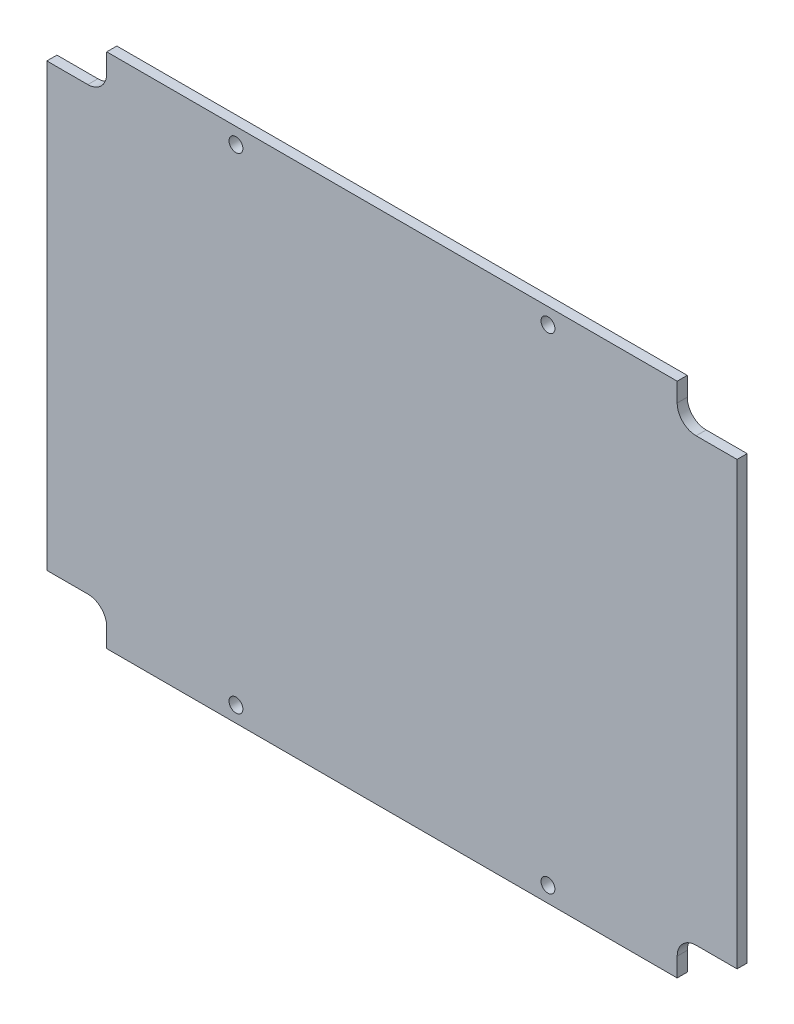
ISO-10303-21;
HEADER;
FILE_DESCRIPTION(('STEP AP214'),'2;1');
FILE_NAME('part.step','',(''),(''),'','','');
FILE_SCHEMA(('AUTOMOTIVE_DESIGN { 1 0 10303 214 1 1 1 1 }'));
ENDSEC;
DATA;
#1=APPLICATION_CONTEXT('core data for automotive mechanical design processes');
#2=APPLICATION_PROTOCOL_DEFINITION('international standard','automotive_design',2000,#1);
#3=PRODUCT_CONTEXT('',#1,'mechanical');
#4=PRODUCT('Part','Part','',(#3));
#5=PRODUCT_RELATED_PRODUCT_CATEGORY('part','',(#4));
#6=PRODUCT_DEFINITION_FORMATION('','',#4);
#7=PRODUCT_DEFINITION_CONTEXT('part definition',#1,'design');
#8=PRODUCT_DEFINITION('design','',#6,#7);
#9=PRODUCT_DEFINITION_SHAPE('','',#8);
#10=(LENGTH_UNIT() NAMED_UNIT(*) SI_UNIT(.MILLI.,.METRE.));
#11=(NAMED_UNIT(*) PLANE_ANGLE_UNIT() SI_UNIT($,.RADIAN.));
#12=(NAMED_UNIT(*) SI_UNIT($,.STERADIAN.) SOLID_ANGLE_UNIT());
#13=UNCERTAINTY_MEASURE_WITH_UNIT(LENGTH_MEASURE(1.E-05),#10,'distance_accuracy_value','');
#14=(GEOMETRIC_REPRESENTATION_CONTEXT(3) GLOBAL_UNCERTAINTY_ASSIGNED_CONTEXT((#13)) GLOBAL_UNIT_ASSIGNED_CONTEXT((#10,
#11,#12)) REPRESENTATION_CONTEXT('',''));
#15=CARTESIAN_POINT('',(0.,0.,0.));
#16=DIRECTION('',(0.,0.,1.));
#17=DIRECTION('',(1.,0.,0.));
#18=AXIS2_PLACEMENT_3D('',#15,#16,#17);
#19=CARTESIAN_POINT('',(-55.493641501856,9.95185693007489,1.6));
#20=DIRECTION('',(0.,0.,1.));
#21=DIRECTION('',(1.,0.,0.));
#22=AXIS2_PLACEMENT_3D('',#19,#20,#21);
#23=PLANE('',#22);
#24=CARTESIAN_POINT('',(24.006358498144,6.45185693007488,1.6));
#25=DIRECTION('',(0.,0.,1.));
#26=DIRECTION('',(1.,0.,0.));
#27=AXIS2_PLACEMENT_3D('',#24,#25,#26);
#28=CIRCLE('',#27,1.1);
#29=CARTESIAN_POINT('',(25.106358498144,6.45185693007488,1.6));
#30=VERTEX_POINT('',#29);
#31=EDGE_CURVE('E321',#30,#30,#28,.T.);
#32=ORIENTED_EDGE('',*,*,#31,.F.);
#33=EDGE_LOOP('',(#32));
#34=FACE_BOUND('',#33,.T.);
#35=CARTESIAN_POINT('',(-25.493641501856,83.4518569300749,1.6));
#36=DIRECTION('',(0.,0.,1.));
#37=DIRECTION('',(1.,0.,0.));
#38=AXIS2_PLACEMENT_3D('',#35,#36,#37);
#39=CIRCLE('',#38,1.1);
#40=CARTESIAN_POINT('',(-24.393641501856,83.4518569300749,1.6));
#41=VERTEX_POINT('',#40);
#42=EDGE_CURVE('E298',#41,#41,#39,.T.);
#43=ORIENTED_EDGE('',*,*,#42,.F.);
#44=EDGE_LOOP('',(#43));
#45=FACE_BOUND('',#44,.T.);
#46=DIRECTION('',(0.,-1.,0.));
#47=VECTOR('',#46,1.);
#48=CARTESIAN_POINT('',(-55.493641501856,79.9518569300749,1.6));
#49=LINE('',#48,#47);
#50=CARTESIAN_POINT('',(-55.493641501856,79.9518569300749,1.6));
#51=VERTEX_POINT('',#50);
#52=CARTESIAN_POINT('',(-55.493641501856,9.95185693007489,1.6));
#53=VERTEX_POINT('',#52);
#54=EDGE_CURVE('E152',#51,#53,#49,.T.);
#55=ORIENTED_EDGE('',*,*,#54,.T.);
#56=DIRECTION('',(1.,0.,0.));
#57=VECTOR('',#56,1.);
#58=CARTESIAN_POINT('',(-55.493641501856,9.95185693007489,1.6));
#59=LINE('',#58,#57);
#60=CARTESIAN_POINT('',(-48.993641501856,9.95185693007489,1.6));
#61=VERTEX_POINT('',#60);
#62=EDGE_CURVE('E143',#53,#61,#59,.T.);
#63=ORIENTED_EDGE('',*,*,#62,.T.);
#64=CARTESIAN_POINT('',(-48.993641501856,6.95185693007489,1.6));
#65=DIRECTION('',(0.,0.,1.));
#66=DIRECTION('',(1.,0.,0.));
#67=AXIS2_PLACEMENT_3D('',#64,#65,#66);
#68=CIRCLE('',#67,3.);
#69=CARTESIAN_POINT('',(-45.993641501856,6.95185693007489,1.6));
#70=VERTEX_POINT('',#69);
#71=EDGE_CURVE('E11',#61,#70,#68,.F.);
#72=ORIENTED_EDGE('',*,*,#71,.T.);
#73=DIRECTION('',(0.,-1.,0.));
#74=VECTOR('',#73,1.);
#75=CARTESIAN_POINT('',(-45.993641501856,9.95185693007489,1.6));
#76=LINE('',#75,#74);
#77=CARTESIAN_POINT('',(-45.993641501856,3.95185693007488,1.6));
#78=VERTEX_POINT('',#77);
#79=EDGE_CURVE('E151',#70,#78,#76,.T.);
#80=ORIENTED_EDGE('',*,*,#79,.T.);
#81=DIRECTION('',(1.,0.,0.));
#82=VECTOR('',#81,1.);
#83=CARTESIAN_POINT('',(-45.993641501856,3.95185693007488,1.6));
#84=LINE('',#83,#82);
#85=CARTESIAN_POINT('',(44.506358498144,3.95185693007488,1.6));
#86=VERTEX_POINT('',#85);
#87=EDGE_CURVE('E307',#78,#86,#84,.T.);
#88=ORIENTED_EDGE('',*,*,#87,.T.);
#89=DIRECTION('',(0.,1.,0.));
#90=VECTOR('',#89,1.);
#91=CARTESIAN_POINT('',(44.506358498144,3.95185693007488,1.6));
#92=LINE('',#91,#90);
#93=CARTESIAN_POINT('',(44.506358498144,6.95185693007489,1.6));
#94=VERTEX_POINT('',#93);
#95=EDGE_CURVE('E209',#86,#94,#92,.T.);
#96=ORIENTED_EDGE('',*,*,#95,.T.);
#97=CARTESIAN_POINT('',(47.506358498144,6.95185693007489,1.6));
#98=DIRECTION('',(0.,0.,1.));
#99=DIRECTION('',(1.,0.,0.));
#100=AXIS2_PLACEMENT_3D('',#97,#98,#99);
#101=CIRCLE('',#100,3.);
#102=CARTESIAN_POINT('',(47.506358498144,9.95185693007489,1.6));
#103=VERTEX_POINT('',#102);
#104=EDGE_CURVE('E202',#94,#103,#101,.F.);
#105=ORIENTED_EDGE('',*,*,#104,.T.);
#106=DIRECTION('',(1.,0.,0.));
#107=VECTOR('',#106,1.);
#108=CARTESIAN_POINT('',(44.506358498144,9.95185693007489,1.6));
#109=LINE('',#108,#107);
#110=CARTESIAN_POINT('',(54.006358498144,9.95185693007489,1.6));
#111=VERTEX_POINT('',#110);
#112=EDGE_CURVE('E206',#103,#111,#109,.T.);
#113=ORIENTED_EDGE('',*,*,#112,.T.);
#114=DIRECTION('',(0.,1.,0.));
#115=VECTOR('',#114,1.);
#116=CARTESIAN_POINT('',(54.006358498144,79.9518569300749,1.6));
#117=LINE('',#116,#115);
#118=CARTESIAN_POINT('',(54.006358498144,79.9518569300749,1.6));
#119=VERTEX_POINT('',#118);
#120=EDGE_CURVE('E219',#111,#119,#117,.T.);
#121=ORIENTED_EDGE('',*,*,#120,.T.);
#122=DIRECTION('',(-1.,0.,0.));
#123=VECTOR('',#122,1.);
#124=CARTESIAN_POINT('',(44.506358498144,79.9518569300749,1.6));
#125=LINE('',#124,#123);
#126=CARTESIAN_POINT('',(47.506358498144,79.9518569300749,1.6));
#127=VERTEX_POINT('',#126);
#128=EDGE_CURVE('E282',#119,#127,#125,.T.);
#129=ORIENTED_EDGE('',*,*,#128,.T.);
#130=CARTESIAN_POINT('',(47.506358498144,82.9518569300749,1.6));
#131=DIRECTION('',(0.,0.,1.));
#132=DIRECTION('',(1.,0.,0.));
#133=AXIS2_PLACEMENT_3D('',#130,#131,#132);
#134=CIRCLE('',#133,3.);
#135=CARTESIAN_POINT('',(44.506358498144,82.9518569300749,1.6));
#136=VERTEX_POINT('',#135);
#137=EDGE_CURVE('E198',#127,#136,#134,.F.);
#138=ORIENTED_EDGE('',*,*,#137,.T.);
#139=DIRECTION('',(0.,1.,0.));
#140=VECTOR('',#139,1.);
#141=CARTESIAN_POINT('',(44.506358498144,85.9518569300749,1.6));
#142=LINE('',#141,#140);
#143=CARTESIAN_POINT('',(44.506358498144,85.9518569300749,1.6));
#144=VERTEX_POINT('',#143);
#145=EDGE_CURVE('E280',#136,#144,#142,.T.);
#146=ORIENTED_EDGE('',*,*,#145,.T.);
#147=DIRECTION('',(-1.,0.,0.));
#148=VECTOR('',#147,1.);
#149=CARTESIAN_POINT('',(-45.993641501856,85.9518569300749,1.6));
#150=LINE('',#149,#148);
#151=CARTESIAN_POINT('',(-45.993641501856,85.9518569300749,1.6));
#152=VERTEX_POINT('',#151);
#153=EDGE_CURVE('E286',#144,#152,#150,.T.);
#154=ORIENTED_EDGE('',*,*,#153,.T.);
#155=DIRECTION('',(0.,-1.,0.));
#156=VECTOR('',#155,1.);
#157=CARTESIAN_POINT('',(-45.993641501856,79.9518569300749,1.6));
#158=LINE('',#157,#156);
#159=CARTESIAN_POINT('',(-45.993641501856,82.9518569300749,1.6));
#160=VERTEX_POINT('',#159);
#161=EDGE_CURVE('E288',#152,#160,#158,.T.);
#162=ORIENTED_EDGE('',*,*,#161,.T.);
#163=CARTESIAN_POINT('',(-48.993641501856,82.9518569300749,1.6));
#164=DIRECTION('',(0.,0.,1.));
#165=DIRECTION('',(1.,0.,0.));
#166=AXIS2_PLACEMENT_3D('',#163,#164,#165);
#167=CIRCLE('',#166,3.);
#168=CARTESIAN_POINT('',(-48.993641501856,79.9518569300749,1.6));
#169=VERTEX_POINT('',#168);
#170=EDGE_CURVE('E194',#160,#169,#167,.F.);
#171=ORIENTED_EDGE('',*,*,#170,.T.);
#172=DIRECTION('',(-1.,0.,0.));
#173=VECTOR('',#172,1.);
#174=CARTESIAN_POINT('',(-55.493641501856,79.9518569300749,1.6));
#175=LINE('',#174,#173);
#176=EDGE_CURVE('E157',#169,#51,#175,.T.);
#177=ORIENTED_EDGE('',*,*,#176,.T.);
#178=EDGE_LOOP('',(#55,#63,#72,#80,#88,#96,#105,#113,#121,#129,#138,#146,#154,#162,#171,#177));
#179=FACE_BOUND('',#178,.T.);
#180=CARTESIAN_POINT('',(24.006358498144,83.4518569300749,1.6));
#181=DIRECTION('',(0.,0.,1.));
#182=DIRECTION('',(1.,0.,0.));
#183=AXIS2_PLACEMENT_3D('',#180,#181,#182);
#184=CIRCLE('',#183,1.1);
#185=CARTESIAN_POINT('',(25.106358498144,83.4518569300749,1.6));
#186=VERTEX_POINT('',#185);
#187=EDGE_CURVE('E315',#186,#186,#184,.T.);
#188=ORIENTED_EDGE('',*,*,#187,.F.);
#189=EDGE_LOOP('',(#188));
#190=FACE_BOUND('',#189,.T.);
#191=CARTESIAN_POINT('',(-25.493641501856,6.45185693007487,1.6));
#192=DIRECTION('',(0.,0.,1.));
#193=DIRECTION('',(1.,0.,0.));
#194=AXIS2_PLACEMENT_3D('',#191,#192,#193);
#195=CIRCLE('',#194,1.1);
#196=CARTESIAN_POINT('',(-24.393641501856,6.45185693007487,1.6));
#197=VERTEX_POINT('',#196);
#198=EDGE_CURVE('E327',#197,#197,#195,.T.);
#199=ORIENTED_EDGE('',*,*,#198,.F.);
#200=EDGE_LOOP('',(#199));
#201=FACE_BOUND('',#200,.T.);
#202=ADVANCED_FACE('F34',(#34,#45,#179,#190,#201),#23,.T.);
#203=CARTESIAN_POINT('',(-55.493641501856,9.95185693007489,0.));
#204=DIRECTION('',(0.,0.,1.));
#205=DIRECTION('',(1.,0.,0.));
#206=AXIS2_PLACEMENT_3D('',#203,#204,#205);
#207=PLANE('',#206);
#208=CARTESIAN_POINT('',(24.006358498144,6.45185693007488,0.));
#209=DIRECTION('',(0.,0.,1.));
#210=DIRECTION('',(1.,0.,0.));
#211=AXIS2_PLACEMENT_3D('',#208,#209,#210);
#212=CIRCLE('',#211,1.1);
#213=CARTESIAN_POINT('',(25.106358498144,6.45185693007488,0.));
#214=VERTEX_POINT('',#213);
#215=EDGE_CURVE('E324',#214,#214,#212,.T.);
#216=ORIENTED_EDGE('',*,*,#215,.T.);
#217=EDGE_LOOP('',(#216));
#218=FACE_BOUND('',#217,.T.);
#219=CARTESIAN_POINT('',(-25.493641501856,83.4518569300749,0.));
#220=DIRECTION('',(0.,0.,1.));
#221=DIRECTION('',(1.,0.,0.));
#222=AXIS2_PLACEMENT_3D('',#219,#220,#221);
#223=CIRCLE('',#222,1.1);
#224=CARTESIAN_POINT('',(-24.393641501856,83.4518569300749,0.));
#225=VERTEX_POINT('',#224);
#226=EDGE_CURVE('E312',#225,#225,#223,.T.);
#227=ORIENTED_EDGE('',*,*,#226,.T.);
#228=EDGE_LOOP('',(#227));
#229=FACE_BOUND('',#228,.T.);
#230=DIRECTION('',(0.,-1.,0.));
#231=VECTOR('',#230,1.);
#232=CARTESIAN_POINT('',(-55.493641501856,79.9518569300749,0.));
#233=LINE('',#232,#231);
#234=CARTESIAN_POINT('',(-55.493641501856,79.9518569300749,0.));
#235=VERTEX_POINT('',#234);
#236=CARTESIAN_POINT('',(-55.493641501856,9.95185693007489,0.));
#237=VERTEX_POINT('',#236);
#238=EDGE_CURVE('E165',#235,#237,#233,.T.);
#239=ORIENTED_EDGE('',*,*,#238,.F.);
#240=DIRECTION('',(-1.,0.,0.));
#241=VECTOR('',#240,1.);
#242=CARTESIAN_POINT('',(-55.493641501856,79.9518569300749,0.));
#243=LINE('',#242,#241);
#244=CARTESIAN_POINT('',(-48.993641501856,79.9518569300749,0.));
#245=VERTEX_POINT('',#244);
#246=EDGE_CURVE('E161',#245,#235,#243,.T.);
#247=ORIENTED_EDGE('',*,*,#246,.F.);
#248=CARTESIAN_POINT('',(-48.993641501856,82.9518569300749,0.));
#249=DIRECTION('',(0.,0.,1.));
#250=DIRECTION('',(1.,0.,0.));
#251=AXIS2_PLACEMENT_3D('',#248,#249,#250);
#252=CIRCLE('',#251,3.);
#253=CARTESIAN_POINT('',(-45.993641501856,82.9518569300749,0.));
#254=VERTEX_POINT('',#253);
#255=EDGE_CURVE('E192',#245,#254,#252,.T.);
#256=ORIENTED_EDGE('',*,*,#255,.T.);
#257=DIRECTION('',(0.,-1.,0.));
#258=VECTOR('',#257,1.);
#259=CARTESIAN_POINT('',(-45.993641501856,79.9518569300749,0.));
#260=LINE('',#259,#258);
#261=CARTESIAN_POINT('',(-45.993641501856,85.9518569300749,0.));
#262=VERTEX_POINT('',#261);
#263=EDGE_CURVE('E250',#262,#254,#260,.T.);
#264=ORIENTED_EDGE('',*,*,#263,.F.);
#265=DIRECTION('',(-1.,0.,0.));
#266=VECTOR('',#265,1.);
#267=CARTESIAN_POINT('',(-45.993641501856,85.9518569300749,0.));
#268=LINE('',#267,#266);
#269=CARTESIAN_POINT('',(44.506358498144,85.9518569300749,0.));
#270=VERTEX_POINT('',#269);
#271=EDGE_CURVE('E248',#270,#262,#268,.T.);
#272=ORIENTED_EDGE('',*,*,#271,.F.);
#273=DIRECTION('',(0.,1.,0.));
#274=VECTOR('',#273,1.);
#275=CARTESIAN_POINT('',(44.506358498144,85.9518569300749,0.));
#276=LINE('',#275,#274);
#277=CARTESIAN_POINT('',(44.506358498144,82.9518569300749,0.));
#278=VERTEX_POINT('',#277);
#279=EDGE_CURVE('E246',#278,#270,#276,.T.);
#280=ORIENTED_EDGE('',*,*,#279,.F.);
#281=CARTESIAN_POINT('',(47.506358498144,82.9518569300749,0.));
#282=DIRECTION('',(0.,0.,1.));
#283=DIRECTION('',(1.,0.,0.));
#284=AXIS2_PLACEMENT_3D('',#281,#282,#283);
#285=CIRCLE('',#284,3.);
#286=CARTESIAN_POINT('',(47.506358498144,79.9518569300749,0.));
#287=VERTEX_POINT('',#286);
#288=EDGE_CURVE('E196',#278,#287,#285,.T.);
#289=ORIENTED_EDGE('',*,*,#288,.T.);
#290=DIRECTION('',(-1.,0.,0.));
#291=VECTOR('',#290,1.);
#292=CARTESIAN_POINT('',(44.506358498144,79.9518569300749,0.));
#293=LINE('',#292,#291);
#294=CARTESIAN_POINT('',(54.006358498144,79.9518569300749,0.));
#295=VERTEX_POINT('',#294);
#296=EDGE_CURVE('E243',#295,#287,#293,.T.);
#297=ORIENTED_EDGE('',*,*,#296,.F.);
#298=DIRECTION('',(0.,1.,0.));
#299=VECTOR('',#298,1.);
#300=CARTESIAN_POINT('',(54.006358498144,79.9518569300749,0.));
#301=LINE('',#300,#299);
#302=CARTESIAN_POINT('',(54.006358498144,9.95185693007489,0.));
#303=VERTEX_POINT('',#302);
#304=EDGE_CURVE('E236',#303,#295,#301,.T.);
#305=ORIENTED_EDGE('',*,*,#304,.F.);
#306=DIRECTION('',(1.,0.,0.));
#307=VECTOR('',#306,1.);
#308=CARTESIAN_POINT('',(44.506358498144,9.95185693007489,0.));
#309=LINE('',#308,#307);
#310=CARTESIAN_POINT('',(47.506358498144,9.95185693007489,0.));
#311=VERTEX_POINT('',#310);
#312=EDGE_CURVE('E229',#311,#303,#309,.T.);
#313=ORIENTED_EDGE('',*,*,#312,.F.);
#314=CARTESIAN_POINT('',(47.506358498144,6.95185693007489,0.));
#315=DIRECTION('',(0.,0.,1.));
#316=DIRECTION('',(1.,0.,0.));
#317=AXIS2_PLACEMENT_3D('',#314,#315,#316);
#318=CIRCLE('',#317,3.);
#319=CARTESIAN_POINT('',(44.506358498144,6.95185693007489,0.));
#320=VERTEX_POINT('',#319);
#321=EDGE_CURVE('E200',#311,#320,#318,.T.);
#322=ORIENTED_EDGE('',*,*,#321,.T.);
#323=DIRECTION('',(0.,1.,0.));
#324=VECTOR('',#323,1.);
#325=CARTESIAN_POINT('',(44.506358498144,3.95185693007488,0.));
#326=LINE('',#325,#324);
#327=CARTESIAN_POINT('',(44.506358498144,3.95185693007488,0.));
#328=VERTEX_POINT('',#327);
#329=EDGE_CURVE('E227',#328,#320,#326,.T.);
#330=ORIENTED_EDGE('',*,*,#329,.F.);
#331=DIRECTION('',(1.,0.,0.));
#332=VECTOR('',#331,1.);
#333=CARTESIAN_POINT('',(-45.993641501856,3.95185693007488,0.));
#334=LINE('',#333,#332);
#335=CARTESIAN_POINT('',(-45.993641501856,3.95185693007488,0.));
#336=VERTEX_POINT('',#335);
#337=EDGE_CURVE('E234',#336,#328,#334,.T.);
#338=ORIENTED_EDGE('',*,*,#337,.F.);
#339=DIRECTION('',(0.,-1.,0.));
#340=VECTOR('',#339,1.);
#341=CARTESIAN_POINT('',(-45.993641501856,9.95185693007489,0.));
#342=LINE('',#341,#340);
#343=CARTESIAN_POINT('',(-45.993641501856,6.95185693007489,0.));
#344=VERTEX_POINT('',#343);
#345=EDGE_CURVE('E238',#344,#336,#342,.T.);
#346=ORIENTED_EDGE('',*,*,#345,.F.);
#347=CARTESIAN_POINT('',(-48.993641501856,6.95185693007489,0.));
#348=DIRECTION('',(0.,0.,1.));
#349=DIRECTION('',(1.,0.,0.));
#350=AXIS2_PLACEMENT_3D('',#347,#348,#349);
#351=CIRCLE('',#350,3.);
#352=CARTESIAN_POINT('',(-48.993641501856,9.95185693007489,0.));
#353=VERTEX_POINT('',#352);
#354=EDGE_CURVE('E42',#344,#353,#351,.T.);
#355=ORIENTED_EDGE('',*,*,#354,.T.);
#356=DIRECTION('',(1.,0.,0.));
#357=VECTOR('',#356,1.);
#358=CARTESIAN_POINT('',(-55.493641501856,9.95185693007489,0.));
#359=LINE('',#358,#357);
#360=EDGE_CURVE('E297',#237,#353,#359,.T.);
#361=ORIENTED_EDGE('',*,*,#360,.F.);
#362=EDGE_LOOP('',(#239,#247,#256,#264,#272,#280,#289,#297,#305,#313,#322,#330,#338,#346,#355,#361));
#363=FACE_BOUND('',#362,.T.);
#364=CARTESIAN_POINT('',(24.006358498144,83.4518569300749,0.));
#365=DIRECTION('',(0.,0.,1.));
#366=DIRECTION('',(1.,0.,0.));
#367=AXIS2_PLACEMENT_3D('',#364,#365,#366);
#368=CIRCLE('',#367,1.1);
#369=CARTESIAN_POINT('',(25.106358498144,83.4518569300749,0.));
#370=VERTEX_POINT('',#369);
#371=EDGE_CURVE('E318',#370,#370,#368,.T.);
#372=ORIENTED_EDGE('',*,*,#371,.T.);
#373=EDGE_LOOP('',(#372));
#374=FACE_BOUND('',#373,.T.);
#375=CARTESIAN_POINT('',(-25.493641501856,6.45185693007487,0.));
#376=DIRECTION('',(0.,0.,1.));
#377=DIRECTION('',(1.,0.,0.));
#378=AXIS2_PLACEMENT_3D('',#375,#376,#377);
#379=CIRCLE('',#378,1.1);
#380=CARTESIAN_POINT('',(-24.393641501856,6.45185693007487,0.));
#381=VERTEX_POINT('',#380);
#382=EDGE_CURVE('E330',#381,#381,#379,.T.);
#383=ORIENTED_EDGE('',*,*,#382,.T.);
#384=EDGE_LOOP('',(#383));
#385=FACE_BOUND('',#384,.T.);
#386=ADVANCED_FACE('F224',(#218,#229,#363,#374,#385),#207,.F.);
#387=CARTESIAN_POINT('',(-55.493641501856,79.9518569300749,1.6));
#388=DIRECTION('',(1.,0.,0.));
#389=DIRECTION('',(0.,0.,-1.));
#390=AXIS2_PLACEMENT_3D('',#387,#388,#389);
#391=PLANE('',#390);
#392=ORIENTED_EDGE('',*,*,#238,.T.);
#393=DIRECTION('',(0.,0.,-1.));
#394=VECTOR('',#393,1.);
#395=CARTESIAN_POINT('',(-55.493641501856,9.95185693007489,1.6));
#396=LINE('',#395,#394);
#397=EDGE_CURVE('E147',#53,#237,#396,.T.);
#398=ORIENTED_EDGE('',*,*,#397,.F.);
#399=ORIENTED_EDGE('',*,*,#54,.F.);
#400=DIRECTION('',(0.,0.,-1.));
#401=VECTOR('',#400,1.);
#402=CARTESIAN_POINT('',(-55.493641501856,79.9518569300749,1.6));
#403=LINE('',#402,#401);
#404=EDGE_CURVE('E254',#51,#235,#403,.T.);
#405=ORIENTED_EDGE('',*,*,#404,.T.);
#406=EDGE_LOOP('',(#392,#398,#399,#405));
#407=FACE_BOUND('',#406,.T.);
#408=ADVANCED_FACE('F163',(#407),#391,.F.);
#409=CARTESIAN_POINT('',(-55.493641501856,9.95185693007489,1.6));
#410=DIRECTION('',(0.,1.,0.));
#411=DIRECTION('',(0.,0.,1.));
#412=AXIS2_PLACEMENT_3D('',#409,#410,#411);
#413=PLANE('',#412);
#414=ORIENTED_EDGE('',*,*,#360,.T.);
#415=DIRECTION('',(0.,0.,-1.));
#416=VECTOR('',#415,1.);
#417=CARTESIAN_POINT('',(-48.993641501856,9.95185693007489,1.6));
#418=LINE('',#417,#416);
#419=EDGE_CURVE('E49',#353,#61,#418,.F.);
#420=ORIENTED_EDGE('',*,*,#419,.T.);
#421=ORIENTED_EDGE('',*,*,#62,.F.);
#422=ORIENTED_EDGE('',*,*,#397,.T.);
#423=EDGE_LOOP('',(#414,#420,#421,#422));
#424=FACE_BOUND('',#423,.T.);
#425=ADVANCED_FACE('F145',(#424),#413,.F.);
#426=CARTESIAN_POINT('',(-45.993641501856,9.95185693007489,1.6));
#427=DIRECTION('',(1.,0.,0.));
#428=DIRECTION('',(0.,0.,-1.));
#429=AXIS2_PLACEMENT_3D('',#426,#427,#428);
#430=PLANE('',#429);
#431=ORIENTED_EDGE('',*,*,#79,.F.);
#432=DIRECTION('',(0.,0.,-1.));
#433=VECTOR('',#432,1.);
#434=CARTESIAN_POINT('',(-45.993641501856,6.95185693007489,0.));
#435=LINE('',#434,#433);
#436=EDGE_CURVE('E188',#70,#344,#435,.T.);
#437=ORIENTED_EDGE('',*,*,#436,.T.);
#438=ORIENTED_EDGE('',*,*,#345,.T.);
#439=DIRECTION('',(0.,0.,-1.));
#440=VECTOR('',#439,1.);
#441=CARTESIAN_POINT('',(-45.993641501856,3.95185693007488,1.6));
#442=LINE('',#441,#440);
#443=EDGE_CURVE('E167',#78,#336,#442,.T.);
#444=ORIENTED_EDGE('',*,*,#443,.F.);
#445=EDGE_LOOP('',(#431,#437,#438,#444));
#446=FACE_BOUND('',#445,.T.);
#447=ADVANCED_FACE('F302',(#446),#430,.F.);
#448=CARTESIAN_POINT('',(-45.993641501856,3.95185693007488,1.6));
#449=DIRECTION('',(0.,1.,0.));
#450=DIRECTION('',(0.,0.,1.));
#451=AXIS2_PLACEMENT_3D('',#448,#449,#450);
#452=PLANE('',#451);
#453=ORIENTED_EDGE('',*,*,#337,.T.);
#454=DIRECTION('',(0.,0.,-1.));
#455=VECTOR('',#454,1.);
#456=CARTESIAN_POINT('',(44.506358498144,3.95185693007488,1.6));
#457=LINE('',#456,#455);
#458=EDGE_CURVE('E173',#86,#328,#457,.T.);
#459=ORIENTED_EDGE('',*,*,#458,.F.);
#460=ORIENTED_EDGE('',*,*,#87,.F.);
#461=ORIENTED_EDGE('',*,*,#443,.T.);
#462=EDGE_LOOP('',(#453,#459,#460,#461));
#463=FACE_BOUND('',#462,.T.);
#464=ADVANCED_FACE('F306',(#463),#452,.F.);
#465=CARTESIAN_POINT('',(44.506358498144,3.95185693007488,1.6));
#466=DIRECTION('',(-1.,0.,0.));
#467=DIRECTION('',(0.,-1.,0.));
#468=AXIS2_PLACEMENT_3D('',#465,#466,#467);
#469=PLANE('',#468);
#470=ORIENTED_EDGE('',*,*,#329,.T.);
#471=DIRECTION('',(0.,0.,-1.));
#472=VECTOR('',#471,1.);
#473=CARTESIAN_POINT('',(44.506358498144,6.95185693007489,1.6));
#474=LINE('',#473,#472);
#475=EDGE_CURVE('E186',#320,#94,#474,.F.);
#476=ORIENTED_EDGE('',*,*,#475,.T.);
#477=ORIENTED_EDGE('',*,*,#95,.F.);
#478=ORIENTED_EDGE('',*,*,#458,.T.);
#479=EDGE_LOOP('',(#470,#476,#477,#478));
#480=FACE_BOUND('',#479,.T.);
#481=ADVANCED_FACE('F232',(#480),#469,.F.);
#482=CARTESIAN_POINT('',(44.506358498144,9.95185693007489,1.6));
#483=DIRECTION('',(0.,1.,0.));
#484=DIRECTION('',(0.,0.,1.));
#485=AXIS2_PLACEMENT_3D('',#482,#483,#484);
#486=PLANE('',#485);
#487=ORIENTED_EDGE('',*,*,#112,.F.);
#488=DIRECTION('',(0.,0.,-1.));
#489=VECTOR('',#488,1.);
#490=CARTESIAN_POINT('',(47.506358498144,9.95185693007489,0.));
#491=LINE('',#490,#489);
#492=EDGE_CURVE('E183',#103,#311,#491,.T.);
#493=ORIENTED_EDGE('',*,*,#492,.T.);
#494=ORIENTED_EDGE('',*,*,#312,.T.);
#495=DIRECTION('',(0.,0.,-1.));
#496=VECTOR('',#495,1.);
#497=CARTESIAN_POINT('',(54.006358498144,9.95185693007489,1.6));
#498=LINE('',#497,#496);
#499=EDGE_CURVE('E217',#111,#303,#498,.T.);
#500=ORIENTED_EDGE('',*,*,#499,.F.);
#501=EDGE_LOOP('',(#487,#493,#494,#500));
#502=FACE_BOUND('',#501,.T.);
#503=ADVANCED_FACE('F214',(#502),#486,.F.);
#504=CARTESIAN_POINT('',(54.006358498144,79.9518569300749,1.6));
#505=DIRECTION('',(-1.,0.,0.));
#506=DIRECTION('',(0.,-1.,0.));
#507=AXIS2_PLACEMENT_3D('',#504,#505,#506);
#508=PLANE('',#507);
#509=ORIENTED_EDGE('',*,*,#304,.T.);
#510=DIRECTION('',(0.,0.,-1.));
#511=VECTOR('',#510,1.);
#512=CARTESIAN_POINT('',(54.006358498144,79.9518569300749,1.6));
#513=LINE('',#512,#511);
#514=EDGE_CURVE('E262',#119,#295,#513,.T.);
#515=ORIENTED_EDGE('',*,*,#514,.F.);
#516=ORIENTED_EDGE('',*,*,#120,.F.);
#517=ORIENTED_EDGE('',*,*,#499,.T.);
#518=EDGE_LOOP('',(#509,#515,#516,#517));
#519=FACE_BOUND('',#518,.T.);
#520=ADVANCED_FACE('F266',(#519),#508,.F.);
#521=CARTESIAN_POINT('',(44.506358498144,79.9518569300749,1.6));
#522=DIRECTION('',(0.,-1.,0.));
#523=DIRECTION('',(0.,0.,-1.));
#524=AXIS2_PLACEMENT_3D('',#521,#522,#523);
#525=PLANE('',#524);
#526=ORIENTED_EDGE('',*,*,#296,.T.);
#527=DIRECTION('',(0.,0.,-1.));
#528=VECTOR('',#527,1.);
#529=CARTESIAN_POINT('',(47.506358498144,79.9518569300749,1.6));
#530=LINE('',#529,#528);
#531=EDGE_CURVE('E181',#287,#127,#530,.F.);
#532=ORIENTED_EDGE('',*,*,#531,.T.);
#533=ORIENTED_EDGE('',*,*,#128,.F.);
#534=ORIENTED_EDGE('',*,*,#514,.T.);
#535=EDGE_LOOP('',(#526,#532,#533,#534));
#536=FACE_BOUND('',#535,.T.);
#537=ADVANCED_FACE('F272',(#536),#525,.F.);
#538=CARTESIAN_POINT('',(44.506358498144,85.9518569300749,1.6));
#539=DIRECTION('',(-1.,0.,0.));
#540=DIRECTION('',(0.,-1.,0.));
#541=AXIS2_PLACEMENT_3D('',#538,#539,#540);
#542=PLANE('',#541);
#543=ORIENTED_EDGE('',*,*,#145,.F.);
#544=DIRECTION('',(0.,0.,-1.));
#545=VECTOR('',#544,1.);
#546=CARTESIAN_POINT('',(44.506358498144,82.9518569300749,0.));
#547=LINE('',#546,#545);
#548=EDGE_CURVE('E178',#136,#278,#547,.T.);
#549=ORIENTED_EDGE('',*,*,#548,.T.);
#550=ORIENTED_EDGE('',*,*,#279,.T.);
#551=DIRECTION('',(0.,0.,-1.));
#552=VECTOR('',#551,1.);
#553=CARTESIAN_POINT('',(44.506358498144,85.9518569300749,1.6));
#554=LINE('',#553,#552);
#555=EDGE_CURVE('E259',#144,#270,#554,.T.);
#556=ORIENTED_EDGE('',*,*,#555,.F.);
#557=EDGE_LOOP('',(#543,#549,#550,#556));
#558=FACE_BOUND('',#557,.T.);
#559=ADVANCED_FACE('F284',(#558),#542,.F.);
#560=CARTESIAN_POINT('',(-45.993641501856,85.9518569300749,1.6));
#561=DIRECTION('',(0.,-1.,0.));
#562=DIRECTION('',(0.,0.,-1.));
#563=AXIS2_PLACEMENT_3D('',#560,#561,#562);
#564=PLANE('',#563);
#565=ORIENTED_EDGE('',*,*,#271,.T.);
#566=DIRECTION('',(0.,0.,-1.));
#567=VECTOR('',#566,1.);
#568=CARTESIAN_POINT('',(-45.993641501856,85.9518569300749,1.6));
#569=LINE('',#568,#567);
#570=EDGE_CURVE('E256',#152,#262,#569,.T.);
#571=ORIENTED_EDGE('',*,*,#570,.F.);
#572=ORIENTED_EDGE('',*,*,#153,.F.);
#573=ORIENTED_EDGE('',*,*,#555,.T.);
#574=EDGE_LOOP('',(#565,#571,#572,#573));
#575=FACE_BOUND('',#574,.T.);
#576=ADVANCED_FACE('F360',(#575),#564,.F.);
#577=CARTESIAN_POINT('',(-45.993641501856,79.9518569300749,1.6));
#578=DIRECTION('',(1.,0.,0.));
#579=DIRECTION('',(0.,0.,-1.));
#580=AXIS2_PLACEMENT_3D('',#577,#578,#579);
#581=PLANE('',#580);
#582=ORIENTED_EDGE('',*,*,#263,.T.);
#583=DIRECTION('',(0.,0.,-1.));
#584=VECTOR('',#583,1.);
#585=CARTESIAN_POINT('',(-45.993641501856,82.9518569300749,1.6));
#586=LINE('',#585,#584);
#587=EDGE_CURVE('E170',#254,#160,#586,.F.);
#588=ORIENTED_EDGE('',*,*,#587,.T.);
#589=ORIENTED_EDGE('',*,*,#161,.F.);
#590=ORIENTED_EDGE('',*,*,#570,.T.);
#591=EDGE_LOOP('',(#582,#588,#589,#590));
#592=FACE_BOUND('',#591,.T.);
#593=ADVANCED_FACE('F356',(#592),#581,.F.);
#594=CARTESIAN_POINT('',(-55.493641501856,79.9518569300749,1.6));
#595=DIRECTION('',(0.,-1.,0.));
#596=DIRECTION('',(0.,0.,-1.));
#597=AXIS2_PLACEMENT_3D('',#594,#595,#596);
#598=PLANE('',#597);
#599=ORIENTED_EDGE('',*,*,#176,.F.);
#600=DIRECTION('',(0.,0.,-1.));
#601=VECTOR('',#600,1.);
#602=CARTESIAN_POINT('',(-48.993641501856,79.9518569300749,0.));
#603=LINE('',#602,#601);
#604=EDGE_CURVE('E166',#169,#245,#603,.T.);
#605=ORIENTED_EDGE('',*,*,#604,.T.);
#606=ORIENTED_EDGE('',*,*,#246,.T.);
#607=ORIENTED_EDGE('',*,*,#404,.F.);
#608=EDGE_LOOP('',(#599,#605,#606,#607));
#609=FACE_BOUND('',#608,.T.);
#610=ADVANCED_FACE('F353',(#609),#598,.F.);
#611=CARTESIAN_POINT('',(-25.493641501856,83.4518569300749,1.6));
#612=DIRECTION('',(0.,0.,-1.));
#613=DIRECTION('',(-1.,0.,0.));
#614=AXIS2_PLACEMENT_3D('',#611,#612,#613);
#615=CYLINDRICAL_SURFACE('',#614,1.1);
#616=ORIENTED_EDGE('',*,*,#42,.T.);
#617=EDGE_LOOP('',(#616));
#618=FACE_BOUND('',#617,.T.);
#619=ORIENTED_EDGE('',*,*,#226,.F.);
#620=EDGE_LOOP('',(#619));
#621=FACE_BOUND('',#620,.T.);
#622=ADVANCED_FACE('F350',(#618,#621),#615,.F.);
#623=CARTESIAN_POINT('',(24.006358498144,83.4518569300749,1.6));
#624=DIRECTION('',(0.,0.,-1.));
#625=DIRECTION('',(-1.,0.,0.));
#626=AXIS2_PLACEMENT_3D('',#623,#624,#625);
#627=CYLINDRICAL_SURFACE('',#626,1.1);
#628=ORIENTED_EDGE('',*,*,#187,.T.);
#629=EDGE_LOOP('',(#628));
#630=FACE_BOUND('',#629,.T.);
#631=ORIENTED_EDGE('',*,*,#371,.F.);
#632=EDGE_LOOP('',(#631));
#633=FACE_BOUND('',#632,.T.);
#634=ADVANCED_FACE('F495',(#630,#633),#627,.F.);
#635=CARTESIAN_POINT('',(24.006358498144,6.45185693007488,1.6));
#636=DIRECTION('',(0.,0.,-1.));
#637=DIRECTION('',(-1.,0.,0.));
#638=AXIS2_PLACEMENT_3D('',#635,#636,#637);
#639=CYLINDRICAL_SURFACE('',#638,1.1);
#640=ORIENTED_EDGE('',*,*,#31,.T.);
#641=EDGE_LOOP('',(#640));
#642=FACE_BOUND('',#641,.T.);
#643=ORIENTED_EDGE('',*,*,#215,.F.);
#644=EDGE_LOOP('',(#643));
#645=FACE_BOUND('',#644,.T.);
#646=ADVANCED_FACE('F486',(#642,#645),#639,.F.);
#647=CARTESIAN_POINT('',(-25.493641501856,6.45185693007487,1.6));
#648=DIRECTION('',(0.,0.,-1.));
#649=DIRECTION('',(-1.,0.,0.));
#650=AXIS2_PLACEMENT_3D('',#647,#648,#649);
#651=CYLINDRICAL_SURFACE('',#650,1.1);
#652=ORIENTED_EDGE('',*,*,#198,.T.);
#653=EDGE_LOOP('',(#652));
#654=FACE_BOUND('',#653,.T.);
#655=ORIENTED_EDGE('',*,*,#382,.F.);
#656=EDGE_LOOP('',(#655));
#657=FACE_BOUND('',#656,.T.);
#658=ADVANCED_FACE('F336',(#654,#657),#651,.F.);
#659=CARTESIAN_POINT('',(-48.993641501856,82.9518569300749,1.6));
#660=DIRECTION('',(0.,0.,1.));
#661=DIRECTION('',(1.,0.,0.));
#662=AXIS2_PLACEMENT_3D('',#659,#660,#661);
#663=CYLINDRICAL_SURFACE('',#662,3.);
#664=ORIENTED_EDGE('',*,*,#170,.F.);
#665=ORIENTED_EDGE('',*,*,#587,.F.);
#666=ORIENTED_EDGE('',*,*,#255,.F.);
#667=ORIENTED_EDGE('',*,*,#604,.F.);
#668=EDGE_LOOP('',(#664,#665,#666,#667));
#669=FACE_BOUND('',#668,.T.);
#670=ADVANCED_FACE('F383',(#669),#663,.F.);
#671=CARTESIAN_POINT('',(47.506358498144,82.9518569300749,1.6));
#672=DIRECTION('',(0.,0.,1.));
#673=DIRECTION('',(1.,0.,0.));
#674=AXIS2_PLACEMENT_3D('',#671,#672,#673);
#675=CYLINDRICAL_SURFACE('',#674,3.);
#676=ORIENTED_EDGE('',*,*,#137,.F.);
#677=ORIENTED_EDGE('',*,*,#531,.F.);
#678=ORIENTED_EDGE('',*,*,#288,.F.);
#679=ORIENTED_EDGE('',*,*,#548,.F.);
#680=EDGE_LOOP('',(#676,#677,#678,#679));
#681=FACE_BOUND('',#680,.T.);
#682=ADVANCED_FACE('F277',(#681),#675,.F.);
#683=CARTESIAN_POINT('',(47.506358498144,6.95185693007489,1.6));
#684=DIRECTION('',(0.,0.,1.));
#685=DIRECTION('',(1.,0.,0.));
#686=AXIS2_PLACEMENT_3D('',#683,#684,#685);
#687=CYLINDRICAL_SURFACE('',#686,3.);
#688=ORIENTED_EDGE('',*,*,#104,.F.);
#689=ORIENTED_EDGE('',*,*,#475,.F.);
#690=ORIENTED_EDGE('',*,*,#321,.F.);
#691=ORIENTED_EDGE('',*,*,#492,.F.);
#692=EDGE_LOOP('',(#688,#689,#690,#691));
#693=FACE_BOUND('',#692,.T.);
#694=ADVANCED_FACE('F221',(#693),#687,.F.);
#695=CARTESIAN_POINT('',(-48.993641501856,6.95185693007489,1.6));
#696=DIRECTION('',(0.,0.,1.));
#697=DIRECTION('',(1.,0.,0.));
#698=AXIS2_PLACEMENT_3D('',#695,#696,#697);
#699=CYLINDRICAL_SURFACE('',#698,3.);
#700=ORIENTED_EDGE('',*,*,#71,.F.);
#701=ORIENTED_EDGE('',*,*,#419,.F.);
#702=ORIENTED_EDGE('',*,*,#354,.F.);
#703=ORIENTED_EDGE('',*,*,#436,.F.);
#704=EDGE_LOOP('',(#700,#701,#702,#703));
#705=FACE_BOUND('',#704,.T.);
#706=ADVANCED_FACE('F36',(#705),#699,.F.);
#707=CLOSED_SHELL('',(#202,#386,#408,#425,#447,#464,#481,#503,#520,#537,#559,#576,#593,#610,
#622,#634,#646,#658,#670,#682,#694,#706));
#708=MANIFOLD_SOLID_BREP('B2',#707);
#709=ADVANCED_BREP_SHAPE_REPRESENTATION('',(#18,#708),#14);
#710=SHAPE_DEFINITION_REPRESENTATION(#9,#709);
ENDSEC;
END-ISO-10303-21;
